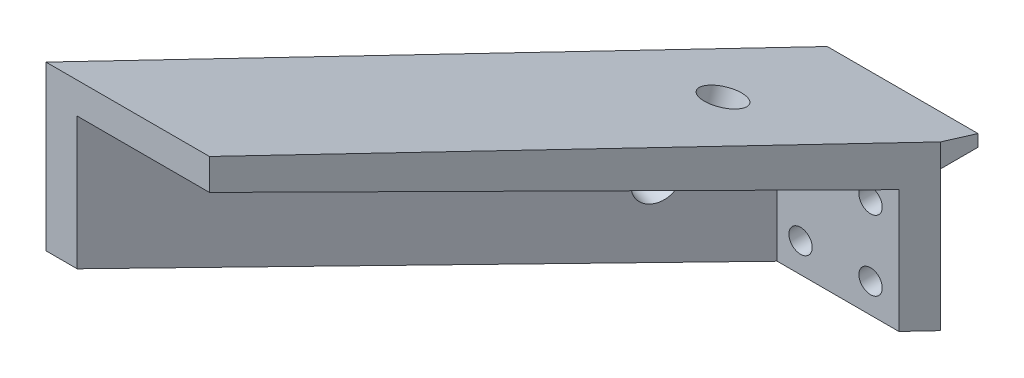
ISO-10303-21;
HEADER;
FILE_DESCRIPTION(('STEP AP214'),'2;1');
FILE_NAME('part.step','',(''),(''),'','','');
FILE_SCHEMA(('AUTOMOTIVE_DESIGN { 1 0 10303 214 1 1 1 1 }'));
ENDSEC;
DATA;
#1=APPLICATION_CONTEXT('core data for automotive mechanical design processes');
#2=APPLICATION_PROTOCOL_DEFINITION('international standard','automotive_design',2000,#1);
#3=PRODUCT_CONTEXT('',#1,'mechanical');
#4=PRODUCT('Part','Part','',(#3));
#5=PRODUCT_RELATED_PRODUCT_CATEGORY('part','',(#4));
#6=PRODUCT_DEFINITION_FORMATION('','',#4);
#7=PRODUCT_DEFINITION_CONTEXT('part definition',#1,'design');
#8=PRODUCT_DEFINITION('design','',#6,#7);
#9=PRODUCT_DEFINITION_SHAPE('','',#8);
#10=(LENGTH_UNIT() NAMED_UNIT(*) SI_UNIT(.MILLI.,.METRE.));
#11=(NAMED_UNIT(*) PLANE_ANGLE_UNIT() SI_UNIT($,.RADIAN.));
#12=(NAMED_UNIT(*) SI_UNIT($,.STERADIAN.) SOLID_ANGLE_UNIT());
#13=UNCERTAINTY_MEASURE_WITH_UNIT(LENGTH_MEASURE(1.E-05),#10,'distance_accuracy_value','');
#14=(GEOMETRIC_REPRESENTATION_CONTEXT(3) GLOBAL_UNCERTAINTY_ASSIGNED_CONTEXT((#13)) GLOBAL_UNIT_ASSIGNED_CONTEXT((#10,
#11,#12)) REPRESENTATION_CONTEXT('',''));
#15=CARTESIAN_POINT('',(0.,0.,0.));
#16=DIRECTION('',(0.,0.,1.));
#17=DIRECTION('',(1.,0.,0.));
#18=AXIS2_PLACEMENT_3D('',#15,#16,#17);
#19=CARTESIAN_POINT('',(10.5,10.5,-4.8));
#20=DIRECTION('',(-1.,0.,0.));
#21=DIRECTION('',(0.,0.,1.));
#22=AXIS2_PLACEMENT_3D('',#19,#20,#21);
#23=PLANE('',#22);
#24=DIRECTION('',(0.,-0.292514661473948,-0.956261038013566));
#25=VECTOR('',#24,1.);
#26=CARTESIAN_POINT('',(10.5,9.15734220568674,-4.38928882954935));
#27=LINE('',#26,#25);
#28=CARTESIAN_POINT('',(10.5,10.5,0.));
#29=VERTEX_POINT('',#28);
#30=CARTESIAN_POINT('',(10.5,9.03170805955704,-4.8));
#31=VERTEX_POINT('',#30);
#32=EDGE_CURVE('E471',#29,#31,#27,.T.);
#33=ORIENTED_EDGE('',*,*,#32,.F.);
#34=DIRECTION('',(0.,-1.,0.));
#35=VECTOR('',#34,1.);
#36=CARTESIAN_POINT('',(10.5,10.5,0.));
#37=LINE('',#36,#35);
#38=CARTESIAN_POINT('',(10.5,7.5,0.));
#39=VERTEX_POINT('',#38);
#40=EDGE_CURVE('E467',#29,#39,#37,.T.);
#41=ORIENTED_EDGE('',*,*,#40,.T.);
#42=DIRECTION('',(0.,0.,1.));
#43=VECTOR('',#42,1.);
#44=CARTESIAN_POINT('',(10.5,7.5,-4.8));
#45=LINE('',#44,#43);
#46=CARTESIAN_POINT('',(10.5,7.5,-4.8));
#47=VERTEX_POINT('',#46);
#48=EDGE_CURVE('E464',#47,#39,#45,.T.);
#49=ORIENTED_EDGE('',*,*,#48,.F.);
#50=DIRECTION('',(0.,-1.,0.));
#51=VECTOR('',#50,1.);
#52=CARTESIAN_POINT('',(10.5,10.5,-4.8));
#53=LINE('',#52,#51);
#54=EDGE_CURVE('E619',#31,#47,#53,.T.);
#55=ORIENTED_EDGE('',*,*,#54,.F.);
#56=EDGE_LOOP('',(#33,#41,#49,#55));
#57=FACE_BOUND('',#56,.T.);
#58=ADVANCED_FACE('F163',(#57),#23,.F.);
#59=CARTESIAN_POINT('',(0.,0.,-4.8));
#60=DIRECTION('',(0.,0.,-1.));
#61=DIRECTION('',(-1.,0.,0.));
#62=AXIS2_PLACEMENT_3D('',#59,#60,#61);
#63=PLANE('',#62);
#64=DIRECTION('',(0.,-1.,0.));
#65=VECTOR('',#64,1.);
#66=CARTESIAN_POINT('',(-8.858928306661,0.,-4.8));
#67=LINE('',#66,#65);
#68=CARTESIAN_POINT('',(-8.858928306661,9.03170805955704,-4.8));
#69=VERTEX_POINT('',#68);
#70=CARTESIAN_POINT('',(-8.858928306661,-10.5,-4.8));
#71=VERTEX_POINT('',#70);
#72=EDGE_CURVE('E182',#69,#71,#67,.T.);
#73=ORIENTED_EDGE('',*,*,#72,.F.);
#74=DIRECTION('',(1.,0.,0.));
#75=VECTOR('',#74,1.);
#76=CARTESIAN_POINT('',(0.,9.03170805955704,-4.8));
#77=LINE('',#76,#75);
#78=EDGE_CURVE('E174',#69,#31,#77,.T.);
#79=ORIENTED_EDGE('',*,*,#78,.T.);
#80=ORIENTED_EDGE('',*,*,#54,.T.);
#81=DIRECTION('',(-1.,0.,0.));
#82=VECTOR('',#81,1.);
#83=CARTESIAN_POINT('',(10.5,7.5,-4.8));
#84=LINE('',#83,#82);
#85=CARTESIAN_POINT('',(-7.5,7.5,-4.8));
#86=VERTEX_POINT('',#85);
#87=EDGE_CURVE('E630',#47,#86,#84,.T.);
#88=ORIENTED_EDGE('',*,*,#87,.T.);
#89=DIRECTION('',(0.,-1.,0.));
#90=VECTOR('',#89,1.);
#91=CARTESIAN_POINT('',(-7.5,7.5,-4.8));
#92=LINE('',#91,#90);
#93=CARTESIAN_POINT('',(-7.5,-10.5,-4.8));
#94=VERTEX_POINT('',#93);
#95=EDGE_CURVE('E478',#86,#94,#92,.T.);
#96=ORIENTED_EDGE('',*,*,#95,.T.);
#97=DIRECTION('',(-1.,0.,0.));
#98=VECTOR('',#97,1.);
#99=CARTESIAN_POINT('',(-7.5,-10.5,-4.8));
#100=LINE('',#99,#98);
#101=EDGE_CURVE('E481',#94,#71,#100,.T.);
#102=ORIENTED_EDGE('',*,*,#101,.T.);
#103=EDGE_LOOP('',(#73,#79,#80,#88,#96,#102));
#104=FACE_BOUND('',#103,.T.);
#105=ADVANCED_FACE('F609',(#104),#63,.T.);
#106=CARTESIAN_POINT('',(0.,0.,0.));
#107=DIRECTION('',(0.,0.,-1.));
#108=DIRECTION('',(-1.,0.,0.));
#109=AXIS2_PLACEMENT_3D('',#106,#107,#108);
#110=PLANE('',#109);
#111=DIRECTION('',(0.,-1.,0.));
#112=VECTOR('',#111,1.);
#113=CARTESIAN_POINT('',(-7.5,7.5,0.));
#114=LINE('',#113,#112);
#115=CARTESIAN_POINT('',(-7.5,7.5,0.));
#116=VERTEX_POINT('',#115);
#117=CARTESIAN_POINT('',(-7.5,-10.5,0.));
#118=VERTEX_POINT('',#117);
#119=EDGE_CURVE('E479',#116,#118,#114,.T.);
#120=ORIENTED_EDGE('',*,*,#119,.F.);
#121=DIRECTION('',(-1.,0.,0.));
#122=VECTOR('',#121,1.);
#123=CARTESIAN_POINT('',(10.5,7.5,0.));
#124=LINE('',#123,#122);
#125=EDGE_CURVE('E470',#39,#116,#124,.T.);
#126=ORIENTED_EDGE('',*,*,#125,.F.);
#127=DIRECTION('',(0.,1.,0.));
#128=VECTOR('',#127,1.);
#129=CARTESIAN_POINT('',(10.5,-10.5,0.));
#130=LINE('',#129,#128);
#131=CARTESIAN_POINT('',(10.5,-10.5,0.));
#132=VERTEX_POINT('',#131);
#133=EDGE_CURVE('E456',#132,#39,#130,.T.);
#134=ORIENTED_EDGE('',*,*,#133,.F.);
#135=DIRECTION('',(1.,0.,0.));
#136=VECTOR('',#135,1.);
#137=CARTESIAN_POINT('',(-10.5,-10.5,0.));
#138=LINE('',#137,#136);
#139=EDGE_CURVE('E278',#118,#132,#138,.T.);
#140=ORIENTED_EDGE('',*,*,#139,.F.);
#141=EDGE_LOOP('',(#120,#126,#134,#140));
#142=FACE_BOUND('',#141,.T.);
#143=CARTESIAN_POINT('',(-3.5,3.5,0.));
#144=DIRECTION('',(0.,0.,-1.));
#145=DIRECTION('',(-1.,0.,0.));
#146=AXIS2_PLACEMENT_3D('',#143,#144,#145);
#147=CIRCLE('',#146,1.5);
#148=CARTESIAN_POINT('',(-5.,3.5,0.));
#149=VERTEX_POINT('',#148);
#150=EDGE_CURVE('E362',#149,#149,#147,.T.);
#151=ORIENTED_EDGE('',*,*,#150,.F.);
#152=EDGE_LOOP('',(#151));
#153=FACE_BOUND('',#152,.T.);
#154=CARTESIAN_POINT('',(5.5,3.5,0.));
#155=DIRECTION('',(0.,0.,-1.));
#156=DIRECTION('',(-1.,0.,0.));
#157=AXIS2_PLACEMENT_3D('',#154,#155,#156);
#158=CIRCLE('',#157,1.5);
#159=CARTESIAN_POINT('',(4.,3.5,0.));
#160=VERTEX_POINT('',#159);
#161=EDGE_CURVE('E369',#160,#160,#158,.T.);
#162=ORIENTED_EDGE('',*,*,#161,.F.);
#163=EDGE_LOOP('',(#162));
#164=FACE_BOUND('',#163,.T.);
#165=CARTESIAN_POINT('',(5.5,-5.5,0.));
#166=DIRECTION('',(0.,0.,-1.));
#167=DIRECTION('',(-1.,0.,0.));
#168=AXIS2_PLACEMENT_3D('',#165,#166,#167);
#169=CIRCLE('',#168,1.5);
#170=CARTESIAN_POINT('',(4.,-5.5,0.));
#171=VERTEX_POINT('',#170);
#172=EDGE_CURVE('E365',#171,#171,#169,.T.);
#173=ORIENTED_EDGE('',*,*,#172,.F.);
#174=EDGE_LOOP('',(#173));
#175=FACE_BOUND('',#174,.T.);
#176=CARTESIAN_POINT('',(-3.5,-5.5,0.));
#177=DIRECTION('',(0.,0.,-1.));
#178=DIRECTION('',(-1.,0.,0.));
#179=AXIS2_PLACEMENT_3D('',#176,#177,#178);
#180=CIRCLE('',#179,1.5);
#181=CARTESIAN_POINT('',(-5.,-5.5,0.));
#182=VERTEX_POINT('',#181);
#183=EDGE_CURVE('E368',#182,#182,#180,.T.);
#184=ORIENTED_EDGE('',*,*,#183,.F.);
#185=EDGE_LOOP('',(#184));
#186=FACE_BOUND('',#185,.T.);
#187=ADVANCED_FACE('F418',(#142,#153,#164,#175,#186),#110,.T.);
#188=CARTESIAN_POINT('',(0.,0.,70.));
#189=DIRECTION('',(0.,0.,1.));
#190=DIRECTION('',(1.,0.,0.));
#191=AXIS2_PLACEMENT_3D('',#188,#189,#190);
#192=PLANE('',#191);
#193=DIRECTION('',(-1.,0.,0.));
#194=VECTOR('',#193,1.);
#195=CARTESIAN_POINT('',(-30.4322955278606,27.9125907981267,70.));
#196=LINE('',#195,#194);
#197=CARTESIAN_POINT('',(-13.4322955278607,27.9125907981267,70.));
#198=VERTEX_POINT('',#197);
#199=CARTESIAN_POINT('',(-30.4322955278606,27.9125907981267,70.));
#200=VERTEX_POINT('',#199);
#201=EDGE_CURVE('E514',#198,#200,#196,.T.);
#202=ORIENTED_EDGE('',*,*,#201,.F.);
#203=DIRECTION('',(0.,1.,0.));
#204=VECTOR('',#203,1.);
#205=CARTESIAN_POINT('',(-13.4322955278606,10.9125907981267,70.));
#206=LINE('',#205,#204);
#207=CARTESIAN_POINT('',(-13.4322955278606,31.9125907981267,70.));
#208=VERTEX_POINT('',#207);
#209=EDGE_CURVE('E395',#198,#208,#206,.T.);
#210=ORIENTED_EDGE('',*,*,#209,.T.);
#211=DIRECTION('',(-1.,0.,0.));
#212=VECTOR('',#211,1.);
#213=CARTESIAN_POINT('',(-13.4322955278606,31.9125907981267,70.));
#214=LINE('',#213,#212);
#215=CARTESIAN_POINT('',(-34.4322955278606,31.9125907981267,70.));
#216=VERTEX_POINT('',#215);
#217=EDGE_CURVE('E433',#208,#216,#214,.T.);
#218=ORIENTED_EDGE('',*,*,#217,.T.);
#219=DIRECTION('',(0.,-1.,0.));
#220=VECTOR('',#219,1.);
#221=CARTESIAN_POINT('',(-34.4322955278606,10.9125907981267,70.));
#222=LINE('',#221,#220);
#223=CARTESIAN_POINT('',(-34.4322955278606,10.9125907981267,70.));
#224=VERTEX_POINT('',#223);
#225=EDGE_CURVE('E376',#216,#224,#222,.T.);
#226=ORIENTED_EDGE('',*,*,#225,.T.);
#227=DIRECTION('',(1.,0.,0.));
#228=VECTOR('',#227,1.);
#229=CARTESIAN_POINT('',(-13.4322955278606,10.9125907981267,70.));
#230=LINE('',#229,#228);
#231=CARTESIAN_POINT('',(-30.4322955278606,10.9125907981267,70.));
#232=VERTEX_POINT('',#231);
#233=EDGE_CURVE('E260',#224,#232,#230,.T.);
#234=ORIENTED_EDGE('',*,*,#233,.T.);
#235=DIRECTION('',(0.,-1.,0.));
#236=VECTOR('',#235,1.);
#237=CARTESIAN_POINT('',(-30.4322955278606,5.70749163800599,70.));
#238=LINE('',#237,#236);
#239=EDGE_CURVE('E499',#200,#232,#238,.T.);
#240=ORIENTED_EDGE('',*,*,#239,.F.);
#241=EDGE_LOOP('',(#202,#210,#218,#226,#234,#240));
#242=FACE_BOUND('',#241,.T.);
#243=ADVANCED_FACE('F408',(#242),#192,.T.);
#244=CARTESIAN_POINT('',(-34.4322955278606,10.9125907981267,70.));
#245=DIRECTION('',(-0.946226367604525,0.,-0.32350527236808));
#246=DIRECTION('',(0.,1.,0.));
#247=AXIS2_PLACEMENT_3D('',#244,#245,#246);
#248=PLANE('',#247);
#249=DIRECTION('',(0.32350527236808,0.,-0.946226367604525));
#250=VECTOR('',#249,1.);
#251=CARTESIAN_POINT('',(-8.71670876613612,-10.5,-5.21598048232155));
#252=LINE('',#251,#250);
#253=CARTESIAN_POINT('',(-10.5,-10.5,0.));
#254=VERTEX_POINT('',#253);
#255=EDGE_CURVE('E13',#254,#71,#252,.T.);
#256=ORIENTED_EDGE('',*,*,#255,.F.);
#257=CARTESIAN_POINT('',(-34.4322955278606,10.9125907981267,70.));
#258=CARTESIAN_POINT('',(-26.4548636852404,3.77506053208445,46.6666666666667));
#259=CARTESIAN_POINT('',(-18.4774318426202,-3.36246973395777,23.3333333333333));
#260=CARTESIAN_POINT('',(-10.5,-10.5,0.));
#261=B_SPLINE_CURVE_WITH_KNOTS('',3,(#257,#258,#259,#260),.UNSPECIFIED.,.F.,.F.,(4,4),(0.,1.),.UNSPECIFIED.);
#262=EDGE_CURVE('E252',#224,#254,#261,.T.);
#263=ORIENTED_EDGE('',*,*,#262,.F.);
#264=ORIENTED_EDGE('',*,*,#225,.F.);
#265=CARTESIAN_POINT('',(-34.4322955278606,31.9125907981267,70.));
#266=CARTESIAN_POINT('',(-26.4548636852404,24.7750605320844,46.6666666666667));
#267=CARTESIAN_POINT('',(-18.4774318426202,17.6375302660422,23.3333333333333));
#268=CARTESIAN_POINT('',(-10.5,10.5,0.));
#269=B_SPLINE_CURVE_WITH_KNOTS('',3,(#265,#266,#267,#268),.UNSPECIFIED.,.F.,.F.,(4,4),(0.,1.),.UNSPECIFIED.);
#270=CARTESIAN_POINT('',(-10.5,10.5000000000001,2.02095284951298E-13));
#271=VERTEX_POINT('',#270);
#272=EDGE_CURVE('E264',#216,#271,#269,.T.);
#273=ORIENTED_EDGE('',*,*,#272,.T.);
#274=DIRECTION('',(0.310749975140568,-0.278032754963553,-0.908918170198788));
#275=VECTOR('',#274,1.);
#276=CARTESIAN_POINT('',(-34.4322955278607,31.9125907981267,70.));
#277=LINE('',#276,#275);
#278=EDGE_CURVE('E621',#271,#69,#277,.T.);
#279=ORIENTED_EDGE('',*,*,#278,.T.);
#280=ORIENTED_EDGE('',*,*,#72,.T.);
#281=EDGE_LOOP('',(#256,#263,#264,#273,#279,#280));
#282=FACE_BOUND('',#281,.T.);
#283=CARTESIAN_POINT('',(-15.2314269147208,3.32442033422709,13.8390353589313));
#284=DIRECTION('',(-0.946226367604525,0.,-0.32350527236808));
#285=DIRECTION('',(-0.32350527236808,0.,0.946226367604525));
#286=AXIS2_PLACEMENT_3D('',#283,#284,#285);
#287=CIRCLE('',#286,2.5);
#288=CARTESIAN_POINT('',(-16.040190095641,3.32442033422709,16.2046012779426));
#289=VERTEX_POINT('',#288);
#290=EDGE_CURVE('E488',#289,#289,#287,.T.);
#291=ORIENTED_EDGE('',*,*,#290,.F.);
#292=EDGE_LOOP('',(#291));
#293=FACE_BOUND('',#292,.T.);
#294=ADVANCED_FACE('F267',(#282,#293),#248,.T.);
#295=CARTESIAN_POINT('',(-13.4322955278606,10.9125907981267,70.));
#296=DIRECTION('',(0.,-0.956261038013566,0.292514661473948));
#297=DIRECTION('',(-1.,0.,0.));
#298=AXIS2_PLACEMENT_3D('',#295,#296,#297);
#299=PLANE('',#298);
#300=DIRECTION('',(1.,0.,0.));
#301=VECTOR('',#300,1.);
#302=CARTESIAN_POINT('',(-13.4322955278606,-9.27642338296419,4.));
#303=LINE('',#302,#301);
#304=CARTESIAN_POINT('',(-6.5,-9.27642338296419,4.));
#305=VERTEX_POINT('',#304);
#306=CARTESIAN_POINT('',(9.13244025555082,-9.27642338296419,4.));
#307=VERTEX_POINT('',#306);
#308=EDGE_CURVE('E358',#305,#307,#303,.T.);
#309=ORIENTED_EDGE('',*,*,#308,.F.);
#310=DIRECTION('',(0.327613780028586,-0.276371284284787,-0.903486648688379));
#311=VECTOR('',#310,1.);
#312=CARTESIAN_POINT('',(-28.6076721171621,9.37335909881648,64.9680905049033));
#313=LINE('',#312,#311);
#314=EDGE_CURVE('E474',#232,#305,#313,.T.);
#315=ORIENTED_EDGE('',*,*,#314,.F.);
#316=ORIENTED_EDGE('',*,*,#233,.F.);
#317=ORIENTED_EDGE('',*,*,#262,.T.);
#318=EDGE_CURVE('E168',#254,#118,#138,.T.);
#319=ORIENTED_EDGE('',*,*,#318,.T.);
#320=ORIENTED_EDGE('',*,*,#139,.T.);
#321=CARTESIAN_POINT('',(-13.4322955278606,10.9125907981267,70.));
#322=CARTESIAN_POINT('',(-5.45486368524043,3.77506053208446,46.6666666666667));
#323=CARTESIAN_POINT('',(2.52256815737978,-3.36246973395777,23.3333333333333));
#324=CARTESIAN_POINT('',(10.5,-10.5,0.));
#325=B_SPLINE_CURVE_WITH_KNOTS('',3,(#321,#322,#323,#324),.UNSPECIFIED.,.F.,.F.,(4,4),(0.,1.),.UNSPECIFIED.);
#326=EDGE_CURVE('E265',#307,#132,#325,.T.);
#327=ORIENTED_EDGE('',*,*,#326,.F.);
#328=EDGE_LOOP('',(#309,#315,#316,#317,#319,#320,#327));
#329=FACE_BOUND('',#328,.T.);
#330=ADVANCED_FACE('F254',(#329),#299,.T.);
#331=CARTESIAN_POINT('',(-13.4322955278606,31.9125907981267,70.));
#332=DIRECTION('',(0.946226367604525,0.,0.32350527236808));
#333=DIRECTION('',(0.,-1.,0.));
#334=AXIS2_PLACEMENT_3D('',#331,#332,#333);
#335=PLANE('',#334);
#336=DIRECTION('',(0.,1.,0.));
#337=VECTOR('',#336,1.);
#338=CARTESIAN_POINT('',(9.13244025555082,31.9125907981267,4.));
#339=LINE('',#338,#337);
#340=CARTESIAN_POINT('',(9.13244025555082,6.5,4.));
#341=VERTEX_POINT('',#340);
#342=EDGE_CURVE('E356',#307,#341,#339,.T.);
#343=ORIENTED_EDGE('',*,*,#342,.F.);
#344=ORIENTED_EDGE('',*,*,#326,.T.);
#345=ORIENTED_EDGE('',*,*,#133,.T.);
#346=ORIENTED_EDGE('',*,*,#40,.F.);
#347=CARTESIAN_POINT('',(-13.4322955278606,31.9125907981267,70.));
#348=CARTESIAN_POINT('',(-5.45486368524043,24.7750605320844,46.6666666666667));
#349=CARTESIAN_POINT('',(2.52256815737978,17.6375302660422,23.3333333333333));
#350=CARTESIAN_POINT('',(10.5,10.5,0.));
#351=B_SPLINE_CURVE_WITH_KNOTS('',3,(#347,#348,#349,#350),.UNSPECIFIED.,.F.,.F.,(4,4),(0.,1.),.UNSPECIFIED.);
#352=EDGE_CURVE('E388',#208,#29,#351,.T.);
#353=ORIENTED_EDGE('',*,*,#352,.F.);
#354=ORIENTED_EDGE('',*,*,#209,.F.);
#355=DIRECTION('',(-0.309260773821067,0.293470061573278,0.904562378576387));
#356=VECTOR('',#355,1.);
#357=CARTESIAN_POINT('',(-13.7953306412025,28.257089506286,71.0618479077507));
#358=LINE('',#357,#356);
#359=EDGE_CURVE('E277',#341,#198,#358,.T.);
#360=ORIENTED_EDGE('',*,*,#359,.F.);
#361=EDGE_LOOP('',(#343,#344,#345,#346,#353,#354,#360));
#362=FACE_BOUND('',#361,.T.);
#363=ADVANCED_FACE('F541',(#362),#335,.T.);
#364=CARTESIAN_POINT('',(-34.4322955278606,31.9125907981267,70.));
#365=DIRECTION('',(0.,0.956261038013566,-0.292514661473948));
#366=DIRECTION('',(1.,0.,0.));
#367=AXIS2_PLACEMENT_3D('',#364,#365,#366);
#368=PLANE('',#367);
#369=ORIENTED_EDGE('',*,*,#278,.F.);
#370=ORIENTED_EDGE('',*,*,#272,.F.);
#371=ORIENTED_EDGE('',*,*,#217,.F.);
#372=ORIENTED_EDGE('',*,*,#352,.T.);
#373=ORIENTED_EDGE('',*,*,#32,.T.);
#374=ORIENTED_EDGE('',*,*,#78,.F.);
#375=EDGE_LOOP('',(#369,#370,#371,#372,#373,#374));
#376=FACE_BOUND('',#375,.T.);
#377=CARTESIAN_POINT('',(-4.50422879723078,14.4625417941263,12.9539637778493));
#378=DIRECTION('',(0.,0.956261038013566,-0.292514661473948));
#379=DIRECTION('',(0.,0.292514661473948,0.956261038013566));
#380=AXIS2_PLACEMENT_3D('',#377,#378,#379);
#381=CIRCLE('',#380,2.5);
#382=CARTESIAN_POINT('',(-4.50422879723078,15.1938284478112,15.3446163728832));
#383=VERTEX_POINT('',#382);
#384=EDGE_CURVE('E492',#383,#383,#381,.T.);
#385=ORIENTED_EDGE('',*,*,#384,.F.);
#386=EDGE_LOOP('',(#385));
#387=FACE_BOUND('',#386,.T.);
#388=ADVANCED_FACE('F165',(#376,#387),#368,.T.);
#389=CARTESIAN_POINT('',(5.5,-5.5,70.0001));
#390=DIRECTION('',(0.,0.,-1.));
#391=DIRECTION('',(-1.,0.,0.));
#392=AXIS2_PLACEMENT_3D('',#389,#390,#391);
#393=CYLINDRICAL_SURFACE('',#392,1.5);
#394=CARTESIAN_POINT('',(5.5,-5.5,4.));
#395=DIRECTION('',(0.,0.,-1.));
#396=DIRECTION('',(-1.,0.,0.));
#397=AXIS2_PLACEMENT_3D('',#394,#395,#396);
#398=CIRCLE('',#397,1.5);
#399=CARTESIAN_POINT('',(4.,-5.5,4.));
#400=VERTEX_POINT('',#399);
#401=EDGE_CURVE('E353',#400,#400,#398,.F.);
#402=ORIENTED_EDGE('',*,*,#401,.T.);
#403=EDGE_LOOP('',(#402));
#404=FACE_BOUND('',#403,.T.);
#405=ORIENTED_EDGE('',*,*,#172,.T.);
#406=EDGE_LOOP('',(#405));
#407=FACE_BOUND('',#406,.T.);
#408=ADVANCED_FACE('F692',(#404,#407),#393,.F.);
#409=CARTESIAN_POINT('',(5.5,3.5,70.0001));
#410=DIRECTION('',(0.,0.,-1.));
#411=DIRECTION('',(-1.,0.,0.));
#412=AXIS2_PLACEMENT_3D('',#409,#410,#411);
#413=CYLINDRICAL_SURFACE('',#412,1.5);
#414=CARTESIAN_POINT('',(5.5,3.5,4.));
#415=DIRECTION('',(0.,0.,-1.));
#416=DIRECTION('',(-1.,0.,0.));
#417=AXIS2_PLACEMENT_3D('',#414,#415,#416);
#418=CIRCLE('',#417,1.5);
#419=CARTESIAN_POINT('',(4.,3.5,4.));
#420=VERTEX_POINT('',#419);
#421=EDGE_CURVE('E349',#420,#420,#418,.F.);
#422=ORIENTED_EDGE('',*,*,#421,.T.);
#423=EDGE_LOOP('',(#422));
#424=FACE_BOUND('',#423,.T.);
#425=ORIENTED_EDGE('',*,*,#161,.T.);
#426=EDGE_LOOP('',(#425));
#427=FACE_BOUND('',#426,.T.);
#428=ADVANCED_FACE('F738',(#424,#427),#413,.F.);
#429=CARTESIAN_POINT('',(-3.5,3.5,70.0001));
#430=DIRECTION('',(0.,0.,-1.));
#431=DIRECTION('',(-1.,0.,0.));
#432=AXIS2_PLACEMENT_3D('',#429,#430,#431);
#433=CYLINDRICAL_SURFACE('',#432,1.5);
#434=CARTESIAN_POINT('',(-3.5,3.5,4.));
#435=DIRECTION('',(0.,0.,-1.));
#436=DIRECTION('',(-1.,0.,0.));
#437=AXIS2_PLACEMENT_3D('',#434,#435,#436);
#438=CIRCLE('',#437,1.5);
#439=CARTESIAN_POINT('',(-5.,3.5,4.));
#440=VERTEX_POINT('',#439);
#441=EDGE_CURVE('E346',#440,#440,#438,.F.);
#442=ORIENTED_EDGE('',*,*,#441,.T.);
#443=EDGE_LOOP('',(#442));
#444=FACE_BOUND('',#443,.T.);
#445=ORIENTED_EDGE('',*,*,#150,.T.);
#446=EDGE_LOOP('',(#445));
#447=FACE_BOUND('',#446,.T.);
#448=ADVANCED_FACE('F731',(#444,#447),#433,.F.);
#449=CARTESIAN_POINT('',(-3.5,-5.5,70.0001));
#450=DIRECTION('',(0.,0.,-1.));
#451=DIRECTION('',(-1.,0.,0.));
#452=AXIS2_PLACEMENT_3D('',#449,#450,#451);
#453=CYLINDRICAL_SURFACE('',#452,1.5);
#454=CARTESIAN_POINT('',(-3.5,-5.5,4.));
#455=DIRECTION('',(0.,0.,-1.));
#456=DIRECTION('',(-1.,0.,0.));
#457=AXIS2_PLACEMENT_3D('',#454,#455,#456);
#458=CIRCLE('',#457,1.5);
#459=CARTESIAN_POINT('',(-5.,-5.5,4.));
#460=VERTEX_POINT('',#459);
#461=EDGE_CURVE('E350',#460,#460,#458,.F.);
#462=ORIENTED_EDGE('',*,*,#461,.T.);
#463=EDGE_LOOP('',(#462));
#464=FACE_BOUND('',#463,.T.);
#465=ORIENTED_EDGE('',*,*,#183,.T.);
#466=EDGE_LOOP('',(#465));
#467=FACE_BOUND('',#466,.T.);
#468=ADVANCED_FACE('F315',(#464,#467),#453,.F.);
#469=CARTESIAN_POINT('',(0.,0.,4.));
#470=DIRECTION('',(0.,0.,-1.));
#471=DIRECTION('',(-1.,0.,0.));
#472=AXIS2_PLACEMENT_3D('',#469,#470,#471);
#473=PLANE('',#472);
#474=ORIENTED_EDGE('',*,*,#308,.T.);
#475=ORIENTED_EDGE('',*,*,#342,.T.);
#476=DIRECTION('',(-1.,0.,0.));
#477=VECTOR('',#476,1.);
#478=CARTESIAN_POINT('',(-6.5,6.5,4.));
#479=LINE('',#478,#477);
#480=CARTESIAN_POINT('',(-6.5,6.5,4.));
#481=VERTEX_POINT('',#480);
#482=EDGE_CURVE('E343',#341,#481,#479,.T.);
#483=ORIENTED_EDGE('',*,*,#482,.T.);
#484=DIRECTION('',(0.,-1.,0.));
#485=VECTOR('',#484,1.);
#486=CARTESIAN_POINT('',(-6.5,-10.197142859563,4.));
#487=LINE('',#486,#485);
#488=EDGE_CURVE('E500',#481,#305,#487,.T.);
#489=ORIENTED_EDGE('',*,*,#488,.T.);
#490=EDGE_LOOP('',(#474,#475,#483,#489));
#491=FACE_BOUND('',#490,.T.);
#492=ORIENTED_EDGE('',*,*,#421,.F.);
#493=EDGE_LOOP('',(#492));
#494=FACE_BOUND('',#493,.T.);
#495=ORIENTED_EDGE('',*,*,#461,.F.);
#496=EDGE_LOOP('',(#495));
#497=FACE_BOUND('',#496,.T.);
#498=ORIENTED_EDGE('',*,*,#441,.F.);
#499=EDGE_LOOP('',(#498));
#500=FACE_BOUND('',#499,.T.);
#501=ORIENTED_EDGE('',*,*,#401,.F.);
#502=EDGE_LOOP('',(#501));
#503=FACE_BOUND('',#502,.T.);
#504=ADVANCED_FACE('F310',(#491,#494,#497,#500,#503),#473,.F.);
#505=CARTESIAN_POINT('',(14.3490882662003,6.5,4.));
#506=DIRECTION('',(0.,0.951192425152569,-0.308598396516208));
#507=DIRECTION('',(-1.,0.,0.));
#508=AXIS2_PLACEMENT_3D('',#505,#506,#507);
#509=PLANE('',#508);
#510=CARTESIAN_POINT('',(-4.50422879723078,9.86157337501037,14.3613731211869));
#511=DIRECTION('',(0.,0.951192425152569,-0.308598396516208));
#512=DIRECTION('',(0.,0.308598396516208,0.951192425152569));
#513=AXIS2_PLACEMENT_3D('',#510,#511,#512);
#514=ELLIPSE('',#513,2.5003555222628,2.5);
#515=CARTESIAN_POINT('',(-4.50422879723078,10.6331790799011,16.7396923541517));
#516=VERTEX_POINT('',#515);
#517=EDGE_CURVE('E495',#516,#516,#514,.T.);
#518=ORIENTED_EDGE('',*,*,#517,.T.);
#519=EDGE_LOOP('',(#518));
#520=FACE_BOUND('',#519,.T.);
#521=ORIENTED_EDGE('',*,*,#359,.T.);
#522=ORIENTED_EDGE('',*,*,#201,.T.);
#523=CARTESIAN_POINT('',(-6.5,6.5,4.));
#524=CARTESIAN_POINT('',(-14.4774318426202,13.6375302660422,26.));
#525=CARTESIAN_POINT('',(-22.4548636852404,20.7750605320845,48.));
#526=CARTESIAN_POINT('',(-30.4322955278606,27.9125907981267,70.));
#527=B_SPLINE_CURVE_WITH_KNOTS('',3,(#523,#524,#525,#526),.UNSPECIFIED.,.F.,.F.,(4,4),(0.,1.),.UNSPECIFIED.);
#528=EDGE_CURVE('E496',#481,#200,#527,.T.);
#529=ORIENTED_EDGE('',*,*,#528,.F.);
#530=ORIENTED_EDGE('',*,*,#482,.F.);
#531=EDGE_LOOP('',(#521,#522,#529,#530));
#532=FACE_BOUND('',#531,.T.);
#533=ADVANCED_FACE('F314',(#520,#532),#509,.F.);
#534=CARTESIAN_POINT('',(-6.5,6.5,4.));
#535=DIRECTION('',(-0.940102765788314,0.,-0.340891169960683));
#536=DIRECTION('',(0.,-1.,0.));
#537=AXIS2_PLACEMENT_3D('',#534,#535,#536);
#538=PLANE('',#537);
#539=CARTESIAN_POINT('',(-10.6372867575488,3.32442033422709,15.4097256437577));
#540=DIRECTION('',(-0.940102765788314,0.,-0.340891169960683));
#541=DIRECTION('',(-0.340891169960683,0.,0.940102765788314));
#542=AXIS2_PLACEMENT_3D('',#539,#540,#541);
#543=ELLIPSE('',#542,2.50042478208154,2.5);
#544=CARTESIAN_POINT('',(-11.4896594869113,3.32442033422709,17.7603818970382));
#545=VERTEX_POINT('',#544);
#546=EDGE_CURVE('E491',#545,#545,#543,.T.);
#547=ORIENTED_EDGE('',*,*,#546,.T.);
#548=EDGE_LOOP('',(#547));
#549=FACE_BOUND('',#548,.T.);
#550=ORIENTED_EDGE('',*,*,#314,.T.);
#551=ORIENTED_EDGE('',*,*,#488,.F.);
#552=ORIENTED_EDGE('',*,*,#528,.T.);
#553=ORIENTED_EDGE('',*,*,#239,.T.);
#554=EDGE_LOOP('',(#550,#551,#552,#553));
#555=FACE_BOUND('',#554,.T.);
#556=ADVANCED_FACE('F308',(#549,#555),#538,.F.);
#557=CARTESIAN_POINT('',(-4.50422879723078,4.89993141399067,15.8791103925888));
#558=DIRECTION('',(0.,0.956261038013566,-0.292514661473948));
#559=DIRECTION('',(0.,0.292514661473948,0.956261038013566));
#560=AXIS2_PLACEMENT_3D('',#557,#558,#559);
#561=CYLINDRICAL_SURFACE('',#560,2.5);
#562=ORIENTED_EDGE('',*,*,#384,.T.);
#563=EDGE_LOOP('',(#562));
#564=FACE_BOUND('',#563,.T.);
#565=ORIENTED_EDGE('',*,*,#517,.F.);
#566=EDGE_LOOP('',(#565));
#567=FACE_BOUND('',#566,.T.);
#568=ADVANCED_FACE('F304',(#564,#567),#561,.F.);
#569=CARTESIAN_POINT('',(-5.76916323867556,3.32442033422709,17.0740880826121));
#570=DIRECTION('',(-0.946226367604525,0.,-0.32350527236808));
#571=DIRECTION('',(-0.32350527236808,0.,0.946226367604525));
#572=AXIS2_PLACEMENT_3D('',#569,#570,#571);
#573=CYLINDRICAL_SURFACE('',#572,2.5);
#574=ORIENTED_EDGE('',*,*,#290,.T.);
#575=EDGE_LOOP('',(#574));
#576=FACE_BOUND('',#575,.T.);
#577=ORIENTED_EDGE('',*,*,#546,.F.);
#578=EDGE_LOOP('',(#577));
#579=FACE_BOUND('',#578,.T.);
#580=ADVANCED_FACE('F299',(#576,#579),#573,.F.);
#581=CARTESIAN_POINT('',(-7.5,-10.5,-4.8));
#582=DIRECTION('',(0.,1.,0.));
#583=DIRECTION('',(-1.,0.,0.));
#584=AXIS2_PLACEMENT_3D('',#581,#582,#583);
#585=PLANE('',#584);
#586=ORIENTED_EDGE('',*,*,#318,.F.);
#587=ORIENTED_EDGE('',*,*,#255,.T.);
#588=ORIENTED_EDGE('',*,*,#101,.F.);
#589=DIRECTION('',(0.,0.,1.));
#590=VECTOR('',#589,1.);
#591=CARTESIAN_POINT('',(-7.5,-10.5,-4.8));
#592=LINE('',#591,#590);
#593=EDGE_CURVE('E276',#94,#118,#592,.T.);
#594=ORIENTED_EDGE('',*,*,#593,.T.);
#595=EDGE_LOOP('',(#586,#587,#588,#594));
#596=FACE_BOUND('',#595,.T.);
#597=ADVANCED_FACE('F274',(#596),#585,.F.);
#598=CARTESIAN_POINT('',(10.5,7.5,-4.8));
#599=DIRECTION('',(0.,1.,0.));
#600=DIRECTION('',(0.,0.,1.));
#601=AXIS2_PLACEMENT_3D('',#598,#599,#600);
#602=PLANE('',#601);
#603=ORIENTED_EDGE('',*,*,#125,.T.);
#604=DIRECTION('',(0.,0.,1.));
#605=VECTOR('',#604,1.);
#606=CARTESIAN_POINT('',(-7.5,7.5,-4.8));
#607=LINE('',#606,#605);
#608=EDGE_CURVE('E477',#86,#116,#607,.T.);
#609=ORIENTED_EDGE('',*,*,#608,.F.);
#610=ORIENTED_EDGE('',*,*,#87,.F.);
#611=ORIENTED_EDGE('',*,*,#48,.T.);
#612=EDGE_LOOP('',(#603,#609,#610,#611));
#613=FACE_BOUND('',#612,.T.);
#614=ADVANCED_FACE('F298',(#613),#602,.F.);
#615=CARTESIAN_POINT('',(-7.5,7.5,-4.8));
#616=DIRECTION('',(-1.,0.,0.));
#617=DIRECTION('',(0.,-1.,0.));
#618=AXIS2_PLACEMENT_3D('',#615,#616,#617);
#619=PLANE('',#618);
#620=ORIENTED_EDGE('',*,*,#119,.T.);
#621=ORIENTED_EDGE('',*,*,#593,.F.);
#622=ORIENTED_EDGE('',*,*,#95,.F.);
#623=ORIENTED_EDGE('',*,*,#608,.T.);
#624=EDGE_LOOP('',(#620,#621,#622,#623));
#625=FACE_BOUND('',#624,.T.);
#626=ADVANCED_FACE('F635',(#625),#619,.F.);
#627=CLOSED_SHELL('',(#58,#105,#187,#243,#294,#330,#363,#388,#408,#428,#448,#468,#504,#533,#556,
#568,#580,#597,#614,#626));
#628=MANIFOLD_SOLID_BREP('B2',#627);
#629=ADVANCED_BREP_SHAPE_REPRESENTATION('',(#18,#628),#14);
#630=SHAPE_DEFINITION_REPRESENTATION(#9,#629);
ENDSEC;
END-ISO-10303-21;
